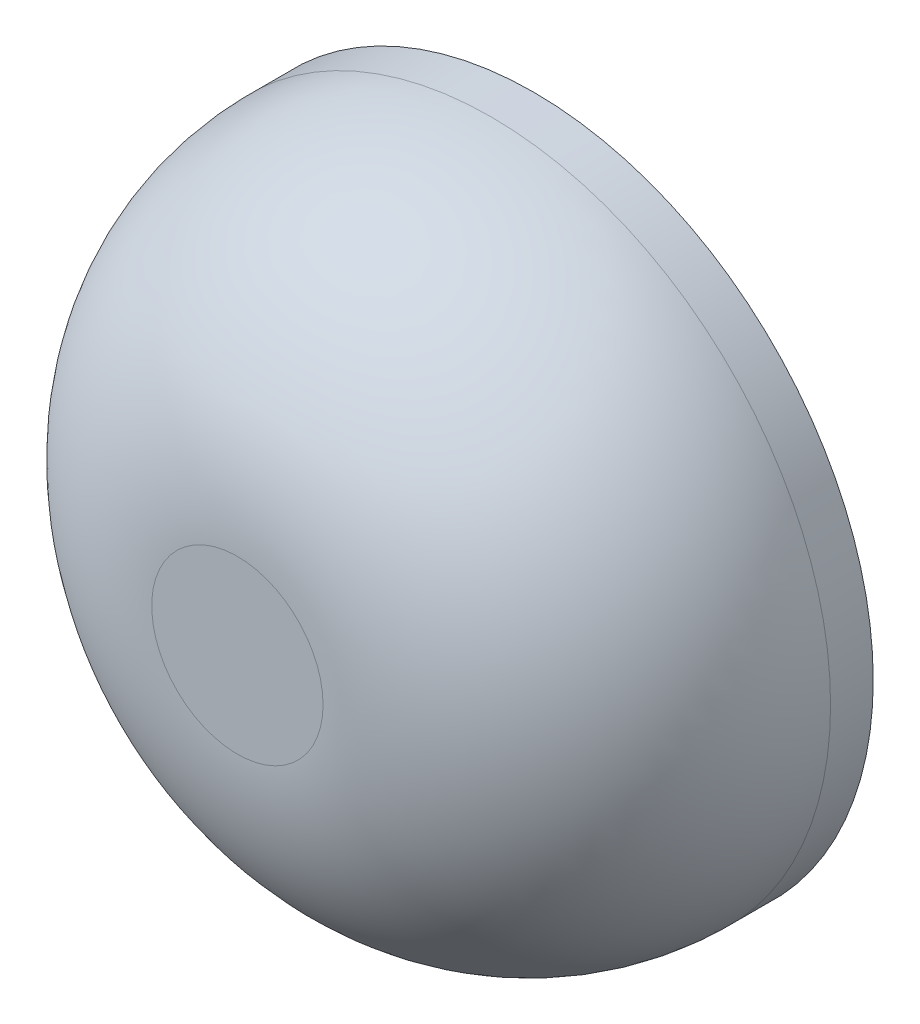
ISO-10303-21;
HEADER;
FILE_DESCRIPTION(('STEP AP214'),'2;1');
FILE_NAME('part.step','',(''),(''),'','','');
FILE_SCHEMA(('AUTOMOTIVE_DESIGN { 1 0 10303 214 1 1 1 1 }'));
ENDSEC;
DATA;
#1=APPLICATION_CONTEXT('core data for automotive mechanical design processes');
#2=APPLICATION_PROTOCOL_DEFINITION('international standard','automotive_design',2000,#1);
#3=PRODUCT_CONTEXT('',#1,'mechanical');
#4=PRODUCT('Part','Part','',(#3));
#5=PRODUCT_RELATED_PRODUCT_CATEGORY('part','',(#4));
#6=PRODUCT_DEFINITION_FORMATION('','',#4);
#7=PRODUCT_DEFINITION_CONTEXT('part definition',#1,'design');
#8=PRODUCT_DEFINITION('design','',#6,#7);
#9=PRODUCT_DEFINITION_SHAPE('','',#8);
#10=(LENGTH_UNIT() NAMED_UNIT(*) SI_UNIT(.MILLI.,.METRE.));
#11=(NAMED_UNIT(*) PLANE_ANGLE_UNIT() SI_UNIT($,.RADIAN.));
#12=(NAMED_UNIT(*) SI_UNIT($,.STERADIAN.) SOLID_ANGLE_UNIT());
#13=UNCERTAINTY_MEASURE_WITH_UNIT(LENGTH_MEASURE(1.E-05),#10,'distance_accuracy_value','');
#14=(GEOMETRIC_REPRESENTATION_CONTEXT(3) GLOBAL_UNCERTAINTY_ASSIGNED_CONTEXT((#13)) GLOBAL_UNIT_ASSIGNED_CONTEXT((#10,
#11,#12)) REPRESENTATION_CONTEXT('',''));
#15=CARTESIAN_POINT('',(0.,0.,0.));
#16=DIRECTION('',(0.,0.,1.));
#17=DIRECTION('',(1.,0.,0.));
#18=AXIS2_PLACEMENT_3D('',#15,#16,#17);
#19=CARTESIAN_POINT('',(0.,0.,61.));
#20=DIRECTION('',(0.,0.,-1.));
#21=DIRECTION('',(-1.,0.,0.));
#22=AXIS2_PLACEMENT_3D('',#19,#20,#21);
#23=CYLINDRICAL_SURFACE('',#22,69.85);
#24=CARTESIAN_POINT('',(0.,0.,8.77999999999998));
#25=DIRECTION('',(0.,0.,1.));
#26=DIRECTION('',(1.,0.,0.));
#27=AXIS2_PLACEMENT_3D('',#24,#25,#26);
#28=CIRCLE('',#27,69.85);
#29=CARTESIAN_POINT('',(-69.85,0.,8.77999999999997));
#30=VERTEX_POINT('',#29);
#31=EDGE_CURVE('E11',#30,#30,#28,.F.);
#32=CARTESIAN_POINT('',(0.,0.,0.));
#33=DIRECTION('',(0.,0.,1.));
#34=DIRECTION('',(1.,0.,0.));
#35=AXIS2_PLACEMENT_3D('',#32,#33,#34);
#36=CIRCLE('',#35,69.85);
#37=CARTESIAN_POINT('',(-69.85,0.,0.));
#38=VERTEX_POINT('',#37);
#39=EDGE_CURVE('E97',#38,#38,#36,.T.);
#40=CARTESIAN_POINT('',(-69.85,0.,8.77999999999997));
#41=CARTESIAN_POINT('',(-69.85,0.,8.68854166666664));
#42=CARTESIAN_POINT('',(-69.85,0.,8.59708333333331));
#43=CARTESIAN_POINT('',(-69.85,0.,8.41416666666664));
#44=CARTESIAN_POINT('',(-69.85,0.,8.32270833333331));
#45=CARTESIAN_POINT('',(-69.85,0.,8.13979166666664));
#46=CARTESIAN_POINT('',(-69.85,0.,8.04833333333331));
#47=CARTESIAN_POINT('',(-69.85,0.,7.86541666666664));
#48=CARTESIAN_POINT('',(-69.85,0.,7.77395833333331));
#49=CARTESIAN_POINT('',(-69.85,0.,7.59104166666664));
#50=CARTESIAN_POINT('',(-69.85,0.,7.49958333333331));
#51=CARTESIAN_POINT('',(-69.85,0.,7.31666666666665));
#52=CARTESIAN_POINT('',(-69.85,0.,7.22520833333331));
#53=CARTESIAN_POINT('',(-69.85,0.,7.04229166666665));
#54=CARTESIAN_POINT('',(-69.85,0.,6.95083333333331));
#55=CARTESIAN_POINT('',(-69.85,0.,6.76791666666665));
#56=CARTESIAN_POINT('',(-69.85,0.,6.67645833333331));
#57=CARTESIAN_POINT('',(-69.85,0.,6.49354166666665));
#58=CARTESIAN_POINT('',(-69.85,0.,6.40208333333331));
#59=CARTESIAN_POINT('',(-69.85,0.,6.21916666666665));
#60=CARTESIAN_POINT('',(-69.85,0.,6.12770833333331));
#61=CARTESIAN_POINT('',(-69.85,0.,5.94479166666665));
#62=CARTESIAN_POINT('',(-69.85,0.,5.85333333333331));
#63=CARTESIAN_POINT('',(-69.85,0.,5.67041666666665));
#64=CARTESIAN_POINT('',(-69.85,0.,5.57895833333332));
#65=CARTESIAN_POINT('',(-69.85,0.,5.39604166666665));
#66=CARTESIAN_POINT('',(-69.85,0.,5.30458333333332));
#67=CARTESIAN_POINT('',(-69.85,0.,5.12166666666665));
#68=CARTESIAN_POINT('',(-69.85,0.,5.03020833333332));
#69=CARTESIAN_POINT('',(-69.85,0.,4.84729166666665));
#70=CARTESIAN_POINT('',(-69.85,0.,4.75583333333332));
#71=CARTESIAN_POINT('',(-69.85,0.,4.57291666666665));
#72=CARTESIAN_POINT('',(-69.85,0.,4.48145833333332));
#73=CARTESIAN_POINT('',(-69.85,0.,4.29854166666665));
#74=CARTESIAN_POINT('',(-69.85,0.,4.20708333333332));
#75=CARTESIAN_POINT('',(-69.85,0.,4.02416666666665));
#76=CARTESIAN_POINT('',(-69.85,0.,3.93270833333332));
#77=CARTESIAN_POINT('',(-69.85,0.,3.74979166666665));
#78=CARTESIAN_POINT('',(-69.85,0.,3.65833333333332));
#79=CARTESIAN_POINT('',(-69.85,0.,3.47541666666665));
#80=CARTESIAN_POINT('',(-69.85,0.,3.38395833333332));
#81=CARTESIAN_POINT('',(-69.85,0.,3.20104166666665));
#82=CARTESIAN_POINT('',(-69.85,0.,3.10958333333332));
#83=CARTESIAN_POINT('',(-69.85,0.,2.92666666666666));
#84=CARTESIAN_POINT('',(-69.85,0.,2.83520833333332));
#85=CARTESIAN_POINT('',(-69.85,0.,2.65229166666666));
#86=CARTESIAN_POINT('',(-69.85,0.,2.56083333333332));
#87=CARTESIAN_POINT('',(-69.85,0.,2.37791666666666));
#88=CARTESIAN_POINT('',(-69.85,0.,2.28645833333332));
#89=CARTESIAN_POINT('',(-69.85,0.,2.10354166666666));
#90=CARTESIAN_POINT('',(-69.85,0.,2.01208333333332));
#91=CARTESIAN_POINT('',(-69.85,0.,1.82916666666665));
#92=CARTESIAN_POINT('',(-69.85,0.,1.73770833333332));
#93=CARTESIAN_POINT('',(-69.85,0.,1.55479166666665));
#94=CARTESIAN_POINT('',(-69.85,0.,1.46333333333332));
#95=CARTESIAN_POINT('',(-69.85,0.,1.28041666666666));
#96=CARTESIAN_POINT('',(-69.85,0.,1.18895833333333));
#97=CARTESIAN_POINT('',(-69.85,0.,1.00604166666666));
#98=CARTESIAN_POINT('',(-69.85,0.,0.914583333333323));
#99=CARTESIAN_POINT('',(-69.85,0.,0.731666666666656));
#100=CARTESIAN_POINT('',(-69.85,0.,0.640208333333325));
#101=CARTESIAN_POINT('',(-69.85,0.,0.45729166666666));
#102=CARTESIAN_POINT('',(-69.85,0.,0.365833333333327));
#103=CARTESIAN_POINT('',(-69.85,0.,0.18291666666666));
#104=CARTESIAN_POINT('',(-69.85,0.,0.0914583333333265));
#105=CARTESIAN_POINT('',(-69.85,0.,0.));
#106=B_SPLINE_CURVE_WITH_KNOTS('',3,(#40,#41,#42,#43,#44,#45,#46,#47,#48,#49,#50,#51,#52,#53,
#54,#55,#56,#57,#58,#59,#60,#61,#62,#63,#64,#65,#66,#67,#68,#69,#70,#71,#72,#73,#74,#75,#76,#77,
#78,#79,#80,#81,#82,#83,#84,#85,#86,#87,#88,#89,#90,#91,#92,#93,#94,#95,#96,#97,#98,#99,#100,
#101,#102,#103,#104,#105),.UNSPECIFIED.,.F.,.F.,(4,2,2,2,2,2,2,2,2,2,2,2,2,2,2,2,2,2,2,2,2,2,2,
2,2,2,2,2,2,2,2,2,4),(0.,0.274375,0.548750000000001,0.823125000000001,1.0975,1.37187499999999,
1.64624999999999,1.920625,2.195,2.469375,2.74375,3.018125,3.29249999999999,3.56687499999999,
3.84124999999999,4.11562499999999,4.38999999999999,4.66437499999999,4.93874999999999,
5.21312499999999,5.48749999999999,5.76187499999999,6.03624999999999,6.31062499999999,
6.58499999999999,6.85937499999999,7.13374999999999,7.40812499999999,7.68249999999998,
7.95687499999999,8.23124999999998,8.50562499999998,8.77999999999998),.UNSPECIFIED.);
#107=EDGE_CURVE('BSEAM86',#30,#38,#106,.T.);
#108=ORIENTED_EDGE('',*,*,#31,.T.);
#109=ORIENTED_EDGE('',*,*,#39,.T.);
#110=ORIENTED_EDGE('',*,*,#107,.T.);
#111=ORIENTED_EDGE('',*,*,#107,.F.);
#112=EDGE_LOOP('',(#108,#110,#109,#111));
#113=FACE_BOUND('',#112,.T.);
#114=ADVANCED_FACE('F86',(#113),#23,.T.);
#115=CARTESIAN_POINT('',(0.,0.,61.));
#116=DIRECTION('',(0.,0.,1.));
#117=DIRECTION('',(1.,0.,0.));
#118=AXIS2_PLACEMENT_3D('',#115,#116,#117);
#119=PLANE('',#118);
#120=CARTESIAN_POINT('',(0.,0.,61.));
#121=DIRECTION('',(0.,0.,1.));
#122=DIRECTION('',(1.,0.,0.));
#123=AXIS2_PLACEMENT_3D('',#120,#121,#122);
#124=CIRCLE('',#123,17.63);
#125=CARTESIAN_POINT('',(17.63,0.,61.));
#126=VERTEX_POINT('',#125);
#127=EDGE_CURVE('E93',#126,#126,#124,.T.);
#128=ORIENTED_EDGE('',*,*,#127,.T.);
#129=EDGE_LOOP('',(#128));
#130=FACE_BOUND('',#129,.T.);
#131=ADVANCED_FACE('F107',(#130),#119,.T.);
#132=CARTESIAN_POINT('',(0.,0.,0.));
#133=DIRECTION('',(0.,0.,1.));
#134=DIRECTION('',(1.,0.,0.));
#135=AXIS2_PLACEMENT_3D('',#132,#133,#134);
#136=PLANE('',#135);
#137=ORIENTED_EDGE('',*,*,#39,.F.);
#138=EDGE_LOOP('',(#137));
#139=FACE_BOUND('',#138,.T.);
#140=ADVANCED_FACE('F105',(#139),#136,.F.);
#141=CARTESIAN_POINT('',(0.,0.,8.78000000000002));
#142=DIRECTION('',(0.,0.,1.));
#143=DIRECTION('',(1.,0.,0.));
#144=AXIS2_PLACEMENT_3D('',#141,#142,#143);
#145=DEGENERATE_TOROIDAL_SURFACE('',#144,17.63,52.22,.T.);
#146=ORIENTED_EDGE('',*,*,#31,.F.);
#147=EDGE_LOOP('',(#146));
#148=FACE_BOUND('',#147,.T.);
#149=ORIENTED_EDGE('',*,*,#127,.F.);
#150=EDGE_LOOP('',(#149));
#151=FACE_BOUND('',#150,.T.);
#152=ADVANCED_FACE('F88',(#148,#151),#145,.T.);
#153=CLOSED_SHELL('',(#114,#131,#140,#152));
#154=MANIFOLD_SOLID_BREP('B2',#153);
#155=ADVANCED_BREP_SHAPE_REPRESENTATION('',(#18,#154),#14);
#156=SHAPE_DEFINITION_REPRESENTATION(#9,#155);
ENDSEC;
END-ISO-10303-21;
